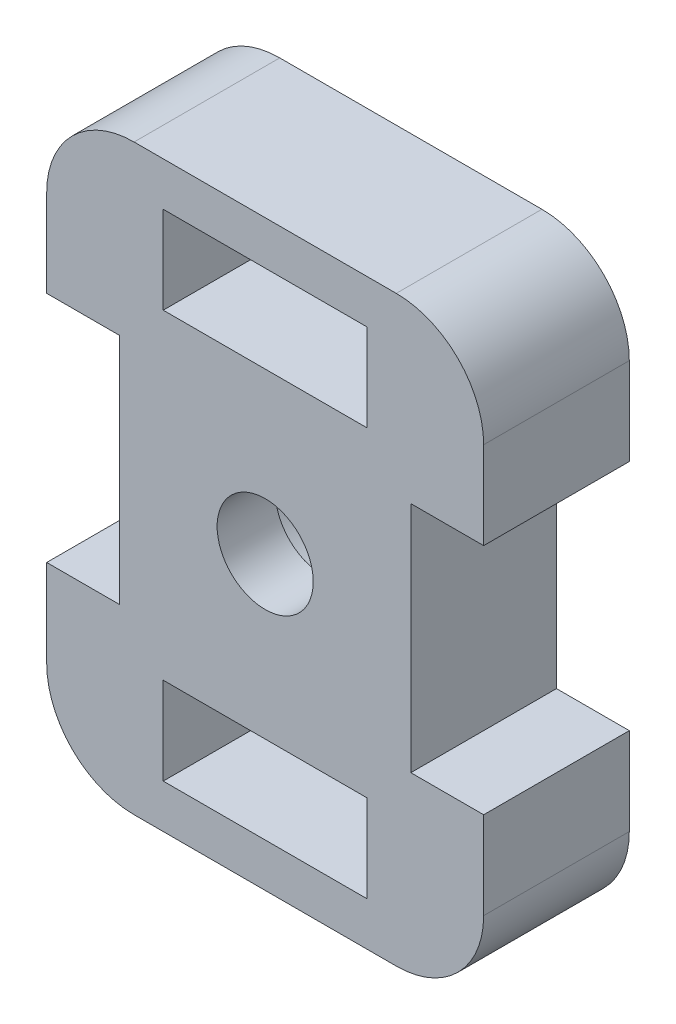
ISO-10303-21;
HEADER;
FILE_DESCRIPTION(('STEP AP214'),'2;1');
FILE_NAME('part.step','',(''),(''),'','','');
FILE_SCHEMA(('AUTOMOTIVE_DESIGN { 1 0 10303 214 1 1 1 1 }'));
ENDSEC;
DATA;
#1=APPLICATION_CONTEXT('core data for automotive mechanical design processes');
#2=APPLICATION_PROTOCOL_DEFINITION('international standard','automotive_design',2000,#1);
#3=PRODUCT_CONTEXT('',#1,'mechanical');
#4=PRODUCT('Part','Part','',(#3));
#5=PRODUCT_RELATED_PRODUCT_CATEGORY('part','',(#4));
#6=PRODUCT_DEFINITION_FORMATION('','',#4);
#7=PRODUCT_DEFINITION_CONTEXT('part definition',#1,'design');
#8=PRODUCT_DEFINITION('design','',#6,#7);
#9=PRODUCT_DEFINITION_SHAPE('','',#8);
#10=(LENGTH_UNIT() NAMED_UNIT(*) SI_UNIT(.MILLI.,.METRE.));
#11=(NAMED_UNIT(*) PLANE_ANGLE_UNIT() SI_UNIT($,.RADIAN.));
#12=(NAMED_UNIT(*) SI_UNIT($,.STERADIAN.) SOLID_ANGLE_UNIT());
#13=UNCERTAINTY_MEASURE_WITH_UNIT(LENGTH_MEASURE(1.E-05),#10,'distance_accuracy_value','');
#14=(GEOMETRIC_REPRESENTATION_CONTEXT(3) GLOBAL_UNCERTAINTY_ASSIGNED_CONTEXT((#13)) GLOBAL_UNIT_ASSIGNED_CONTEXT((#10,
#11,#12)) REPRESENTATION_CONTEXT('',''));
#15=CARTESIAN_POINT('',(0.,0.,0.));
#16=DIRECTION('',(0.,0.,1.));
#17=DIRECTION('',(1.,0.,0.));
#18=AXIS2_PLACEMENT_3D('',#15,#16,#17);
#19=CARTESIAN_POINT('',(0.,0.,40.));
#20=DIRECTION('',(0.,0.,1.));
#21=DIRECTION('',(1.,0.,0.));
#22=AXIS2_PLACEMENT_3D('',#19,#20,#21);
#23=CYLINDRICAL_SURFACE('',#22,1.65);
#24=CARTESIAN_POINT('',(0.,0.,45.));
#25=DIRECTION('',(0.,0.,-1.));
#26=DIRECTION('',(1.,0.,0.));
#27=AXIS2_PLACEMENT_3D('',#24,#25,#26);
#28=CIRCLE('',#27,1.65);
#29=CARTESIAN_POINT('',(1.65000000000001,0.,45.));
#30=VERTEX_POINT('',#29);
#31=EDGE_CURVE('E375',#30,#30,#28,.T.);
#32=ORIENTED_EDGE('',*,*,#31,.F.);
#33=EDGE_LOOP('',(#32));
#34=FACE_BOUND('',#33,.T.);
#35=CARTESIAN_POINT('',(0.,0.,43.));
#36=DIRECTION('',(0.,0.,-1.));
#37=DIRECTION('',(1.,0.,0.));
#38=AXIS2_PLACEMENT_3D('',#35,#36,#37);
#39=CIRCLE('',#38,1.65);
#40=CARTESIAN_POINT('',(1.65000000000001,0.,43.));
#41=VERTEX_POINT('',#40);
#42=EDGE_CURVE('E775',#41,#41,#39,.T.);
#43=ORIENTED_EDGE('',*,*,#42,.T.);
#44=EDGE_LOOP('',(#43));
#45=FACE_BOUND('',#44,.T.);
#46=ADVANCED_FACE('F16',(#34,#45),#23,.F.);
#47=CARTESIAN_POINT('',(3.5,7.27715203538537,40.));
#48=DIRECTION('',(1.,0.,0.));
#49=DIRECTION('',(0.,1.,0.));
#50=AXIS2_PLACEMENT_3D('',#47,#48,#49);
#51=PLANE('',#50);
#52=DIRECTION('',(0.,1.,0.));
#53=VECTOR('',#52,1.);
#54=CARTESIAN_POINT('',(3.5,7.27715203538537,45.));
#55=LINE('',#54,#53);
#56=CARTESIAN_POINT('',(3.5,5.5,45.));
#57=VERTEX_POINT('',#56);
#58=CARTESIAN_POINT('',(3.5,8.5,45.));
#59=VERTEX_POINT('',#58);
#60=EDGE_CURVE('E386',#57,#59,#55,.T.);
#61=ORIENTED_EDGE('',*,*,#60,.T.);
#62=DIRECTION('',(0.,0.,1.));
#63=VECTOR('',#62,1.);
#64=CARTESIAN_POINT('',(3.5,8.5,40.));
#65=LINE('',#64,#63);
#66=CARTESIAN_POINT('',(3.5,8.5,40.));
#67=VERTEX_POINT('',#66);
#68=EDGE_CURVE('E407',#67,#59,#65,.T.);
#69=ORIENTED_EDGE('',*,*,#68,.F.);
#70=DIRECTION('',(0.,1.,0.));
#71=VECTOR('',#70,1.);
#72=CARTESIAN_POINT('',(3.5,7.27715203538537,40.));
#73=LINE('',#72,#71);
#74=CARTESIAN_POINT('',(3.5,5.5,40.));
#75=VERTEX_POINT('',#74);
#76=EDGE_CURVE('E323',#75,#67,#73,.T.);
#77=ORIENTED_EDGE('',*,*,#76,.F.);
#78=DIRECTION('',(0.,0.,1.));
#79=VECTOR('',#78,1.);
#80=CARTESIAN_POINT('',(3.5,5.5,40.));
#81=LINE('',#80,#79);
#82=EDGE_CURVE('E397',#75,#57,#81,.T.);
#83=ORIENTED_EDGE('',*,*,#82,.T.);
#84=EDGE_LOOP('',(#61,#69,#77,#83));
#85=FACE_BOUND('',#84,.T.);
#86=ADVANCED_FACE('F561',(#85),#51,.F.);
#87=CARTESIAN_POINT('',(0.292325974442065,8.5,40.));
#88=DIRECTION('',(0.,1.,0.));
#89=DIRECTION('',(-1.,0.,0.));
#90=AXIS2_PLACEMENT_3D('',#87,#88,#89);
#91=PLANE('',#90);
#92=DIRECTION('',(-1.,0.,0.));
#93=VECTOR('',#92,1.);
#94=CARTESIAN_POINT('',(0.292325974442065,8.5,45.));
#95=LINE('',#94,#93);
#96=CARTESIAN_POINT('',(-3.5,8.5,45.));
#97=VERTEX_POINT('',#96);
#98=EDGE_CURVE('E390',#59,#97,#95,.T.);
#99=ORIENTED_EDGE('',*,*,#98,.T.);
#100=DIRECTION('',(0.,0.,1.));
#101=VECTOR('',#100,1.);
#102=CARTESIAN_POINT('',(-3.5,8.5,40.));
#103=LINE('',#102,#101);
#104=CARTESIAN_POINT('',(-3.5,8.5,40.));
#105=VERTEX_POINT('',#104);
#106=EDGE_CURVE('E404',#105,#97,#103,.T.);
#107=ORIENTED_EDGE('',*,*,#106,.F.);
#108=DIRECTION('',(-1.,0.,0.));
#109=VECTOR('',#108,1.);
#110=CARTESIAN_POINT('',(0.292325974442065,8.5,40.));
#111=LINE('',#110,#109);
#112=EDGE_CURVE('E327',#67,#105,#111,.T.);
#113=ORIENTED_EDGE('',*,*,#112,.F.);
#114=ORIENTED_EDGE('',*,*,#68,.T.);
#115=EDGE_LOOP('',(#99,#107,#113,#114));
#116=FACE_BOUND('',#115,.T.);
#117=ADVANCED_FACE('F566',(#116),#91,.F.);
#118=CARTESIAN_POINT('',(-3.5,6.55768603831532,40.));
#119=DIRECTION('',(1.,0.,0.));
#120=DIRECTION('',(0.,1.,0.));
#121=AXIS2_PLACEMENT_3D('',#118,#119,#120);
#122=PLANE('',#121);
#123=DIRECTION('',(0.,1.,0.));
#124=VECTOR('',#123,1.);
#125=CARTESIAN_POINT('',(-3.5,6.55768603831532,45.));
#126=LINE('',#125,#124);
#127=CARTESIAN_POINT('',(-3.5,5.5,45.));
#128=VERTEX_POINT('',#127);
#129=EDGE_CURVE('E270',#128,#97,#126,.T.);
#130=ORIENTED_EDGE('',*,*,#129,.F.);
#131=DIRECTION('',(0.,0.,1.));
#132=VECTOR('',#131,1.);
#133=CARTESIAN_POINT('',(-3.5,5.5,40.));
#134=LINE('',#133,#132);
#135=CARTESIAN_POINT('',(-3.5,5.5,40.));
#136=VERTEX_POINT('',#135);
#137=EDGE_CURVE('E400',#136,#128,#134,.T.);
#138=ORIENTED_EDGE('',*,*,#137,.F.);
#139=DIRECTION('',(0.,1.,0.));
#140=VECTOR('',#139,1.);
#141=CARTESIAN_POINT('',(-3.5,6.55768603831532,40.));
#142=LINE('',#141,#140);
#143=EDGE_CURVE('E330',#136,#105,#142,.T.);
#144=ORIENTED_EDGE('',*,*,#143,.T.);
#145=ORIENTED_EDGE('',*,*,#106,.T.);
#146=EDGE_LOOP('',(#130,#138,#144,#145));
#147=FACE_BOUND('',#146,.T.);
#148=ADVANCED_FACE('F590',(#147),#122,.T.);
#149=CARTESIAN_POINT('',(3.5,-7.23015354014933,40.));
#150=DIRECTION('',(1.,0.,0.));
#151=DIRECTION('',(0.,1.,0.));
#152=AXIS2_PLACEMENT_3D('',#149,#150,#151);
#153=PLANE('',#152);
#154=DIRECTION('',(0.,1.,0.));
#155=VECTOR('',#154,1.);
#156=CARTESIAN_POINT('',(3.5,-7.23015354014933,45.));
#157=LINE('',#156,#155);
#158=CARTESIAN_POINT('',(3.5,-8.5,45.));
#159=VERTEX_POINT('',#158);
#160=CARTESIAN_POINT('',(3.5,-5.5,45.));
#161=VERTEX_POINT('',#160);
#162=EDGE_CURVE('E353',#159,#161,#157,.T.);
#163=ORIENTED_EDGE('',*,*,#162,.T.);
#164=DIRECTION('',(0.,0.,1.));
#165=VECTOR('',#164,1.);
#166=CARTESIAN_POINT('',(3.5,-5.5,40.));
#167=LINE('',#166,#165);
#168=CARTESIAN_POINT('',(3.5,-5.5,40.));
#169=VERTEX_POINT('',#168);
#170=EDGE_CURVE('E401',#169,#161,#167,.T.);
#171=ORIENTED_EDGE('',*,*,#170,.F.);
#172=DIRECTION('',(0.,1.,0.));
#173=VECTOR('',#172,1.);
#174=CARTESIAN_POINT('',(3.5,-7.23015354014933,40.));
#175=LINE('',#174,#173);
#176=CARTESIAN_POINT('',(3.5,-8.5,40.));
#177=VERTEX_POINT('',#176);
#178=EDGE_CURVE('E275',#177,#169,#175,.T.);
#179=ORIENTED_EDGE('',*,*,#178,.F.);
#180=DIRECTION('',(0.,0.,1.));
#181=VECTOR('',#180,1.);
#182=CARTESIAN_POINT('',(3.5,-8.5,40.));
#183=LINE('',#182,#181);
#184=EDGE_CURVE('E243',#177,#159,#183,.T.);
#185=ORIENTED_EDGE('',*,*,#184,.T.);
#186=EDGE_LOOP('',(#163,#171,#179,#185));
#187=FACE_BOUND('',#186,.T.);
#188=ADVANCED_FACE('F586',(#187),#153,.F.);
#189=CARTESIAN_POINT('',(0.0222343951463693,-5.5,40.));
#190=DIRECTION('',(0.,1.,0.));
#191=DIRECTION('',(-1.,0.,0.));
#192=AXIS2_PLACEMENT_3D('',#189,#190,#191);
#193=PLANE('',#192);
#194=DIRECTION('',(-1.,0.,0.));
#195=VECTOR('',#194,1.);
#196=CARTESIAN_POINT('',(0.0222343951463693,-5.5,45.));
#197=LINE('',#196,#195);
#198=CARTESIAN_POINT('',(-3.5,-5.5,45.));
#199=VERTEX_POINT('',#198);
#200=EDGE_CURVE('E357',#161,#199,#197,.T.);
#201=ORIENTED_EDGE('',*,*,#200,.T.);
#202=DIRECTION('',(0.,0.,1.));
#203=VECTOR('',#202,1.);
#204=CARTESIAN_POINT('',(-3.5,-5.5,40.));
#205=LINE('',#204,#203);
#206=CARTESIAN_POINT('',(-3.5,-5.5,40.));
#207=VERTEX_POINT('',#206);
#208=EDGE_CURVE('E432',#207,#199,#205,.T.);
#209=ORIENTED_EDGE('',*,*,#208,.F.);
#210=DIRECTION('',(-1.,0.,0.));
#211=VECTOR('',#210,1.);
#212=CARTESIAN_POINT('',(0.0222343951463693,-5.5,40.));
#213=LINE('',#212,#211);
#214=EDGE_CURVE('E283',#169,#207,#213,.T.);
#215=ORIENTED_EDGE('',*,*,#214,.F.);
#216=ORIENTED_EDGE('',*,*,#170,.T.);
#217=EDGE_LOOP('',(#201,#209,#215,#216));
#218=FACE_BOUND('',#217,.T.);
#219=ADVANCED_FACE('F582',(#218),#193,.F.);
#220=CARTESIAN_POINT('',(-3.5,-4.68377959541974,40.));
#221=DIRECTION('',(1.,0.,0.));
#222=DIRECTION('',(0.,1.,0.));
#223=AXIS2_PLACEMENT_3D('',#220,#221,#222);
#224=PLANE('',#223);
#225=DIRECTION('',(0.,1.,0.));
#226=VECTOR('',#225,1.);
#227=CARTESIAN_POINT('',(-3.5,-4.68377959541974,45.));
#228=LINE('',#227,#226);
#229=CARTESIAN_POINT('',(-3.5,-8.5,45.));
#230=VERTEX_POINT('',#229);
#231=EDGE_CURVE('E361',#230,#199,#228,.T.);
#232=ORIENTED_EDGE('',*,*,#231,.F.);
#233=DIRECTION('',(0.,0.,1.));
#234=VECTOR('',#233,1.);
#235=CARTESIAN_POINT('',(-3.5,-8.5,40.));
#236=LINE('',#235,#234);
#237=CARTESIAN_POINT('',(-3.5,-8.5,40.));
#238=VERTEX_POINT('',#237);
#239=EDGE_CURVE('E429',#238,#230,#236,.T.);
#240=ORIENTED_EDGE('',*,*,#239,.F.);
#241=DIRECTION('',(0.,1.,0.));
#242=VECTOR('',#241,1.);
#243=CARTESIAN_POINT('',(-3.5,-4.68377959541974,40.));
#244=LINE('',#243,#242);
#245=EDGE_CURVE('E725',#238,#207,#244,.T.);
#246=ORIENTED_EDGE('',*,*,#245,.T.);
#247=ORIENTED_EDGE('',*,*,#208,.T.);
#248=EDGE_LOOP('',(#232,#240,#246,#247));
#249=FACE_BOUND('',#248,.T.);
#250=ADVANCED_FACE('F579',(#249),#224,.T.);
#251=CARTESIAN_POINT('',(0.,-4.,40.));
#252=DIRECTION('',(0.,1.,0.));
#253=DIRECTION('',(-1.,0.,0.));
#254=AXIS2_PLACEMENT_3D('',#251,#252,#253);
#255=PLANE('',#254);
#256=DIRECTION('',(-1.,0.,0.));
#257=VECTOR('',#256,1.);
#258=CARTESIAN_POINT('',(0.,-4.,45.));
#259=LINE('',#258,#257);
#260=CARTESIAN_POINT('',(7.5,-4.,45.));
#261=VERTEX_POINT('',#260);
#262=CARTESIAN_POINT('',(5.,-4.,45.));
#263=VERTEX_POINT('',#262);
#264=EDGE_CURVE('E238',#261,#263,#259,.T.);
#265=ORIENTED_EDGE('',*,*,#264,.F.);
#266=DIRECTION('',(0.,0.,1.));
#267=VECTOR('',#266,1.);
#268=CARTESIAN_POINT('',(7.5,-4.,40.));
#269=LINE('',#268,#267);
#270=CARTESIAN_POINT('',(7.5,-4.,40.));
#271=VERTEX_POINT('',#270);
#272=EDGE_CURVE('E232',#271,#261,#269,.T.);
#273=ORIENTED_EDGE('',*,*,#272,.F.);
#274=DIRECTION('',(-1.,0.,0.));
#275=VECTOR('',#274,1.);
#276=CARTESIAN_POINT('',(0.,-4.,40.));
#277=LINE('',#276,#275);
#278=CARTESIAN_POINT('',(5.,-4.,40.));
#279=VERTEX_POINT('',#278);
#280=EDGE_CURVE('E236',#271,#279,#277,.T.);
#281=ORIENTED_EDGE('',*,*,#280,.T.);
#282=DIRECTION('',(0.,0.,1.));
#283=VECTOR('',#282,1.);
#284=CARTESIAN_POINT('',(5.,-4.,40.));
#285=LINE('',#284,#283);
#286=EDGE_CURVE('E338',#279,#263,#285,.T.);
#287=ORIENTED_EDGE('',*,*,#286,.T.);
#288=EDGE_LOOP('',(#265,#273,#281,#287));
#289=FACE_BOUND('',#288,.T.);
#290=ADVANCED_FACE('F234',(#289),#255,.T.);
#291=CARTESIAN_POINT('',(7.5,-1.50786714585182,40.));
#292=DIRECTION('',(-1.,0.,0.));
#293=DIRECTION('',(0.,0.,1.));
#294=AXIS2_PLACEMENT_3D('',#291,#292,#293);
#295=PLANE('',#294);
#296=DIRECTION('',(0.,-1.,0.));
#297=VECTOR('',#296,1.);
#298=CARTESIAN_POINT('',(7.5,-1.50786714585182,45.));
#299=LINE('',#298,#297);
#300=CARTESIAN_POINT('',(7.5,-7.,45.));
#301=VERTEX_POINT('',#300);
#302=EDGE_CURVE('E340',#261,#301,#299,.T.);
#303=ORIENTED_EDGE('',*,*,#302,.T.);
#304=DIRECTION('',(0.,0.,1.));
#305=VECTOR('',#304,1.);
#306=CARTESIAN_POINT('',(7.5,-7.,40.));
#307=LINE('',#306,#305);
#308=CARTESIAN_POINT('',(7.5,-7.,40.));
#309=VERTEX_POINT('',#308);
#310=EDGE_CURVE('E250',#301,#309,#307,.F.);
#311=ORIENTED_EDGE('',*,*,#310,.T.);
#312=DIRECTION('',(0.,-1.,0.));
#313=VECTOR('',#312,1.);
#314=CARTESIAN_POINT('',(7.5,-1.50786714585182,40.));
#315=LINE('',#314,#313);
#316=EDGE_CURVE('E247',#271,#309,#315,.T.);
#317=ORIENTED_EDGE('',*,*,#316,.F.);
#318=ORIENTED_EDGE('',*,*,#272,.T.);
#319=EDGE_LOOP('',(#303,#311,#317,#318));
#320=FACE_BOUND('',#319,.T.);
#321=ADVANCED_FACE('F248',(#320),#295,.F.);
#322=CARTESIAN_POINT('',(0.,-10.,40.));
#323=DIRECTION('',(0.,-1.,0.));
#324=DIRECTION('',(0.,0.,-1.));
#325=AXIS2_PLACEMENT_3D('',#322,#323,#324);
#326=PLANE('',#325);
#327=DIRECTION('',(1.,0.,0.));
#328=VECTOR('',#327,1.);
#329=CARTESIAN_POINT('',(0.,-10.,40.));
#330=LINE('',#329,#328);
#331=CARTESIAN_POINT('',(-4.5,-10.,40.));
#332=VERTEX_POINT('',#331);
#333=CARTESIAN_POINT('',(4.5,-10.,40.));
#334=VERTEX_POINT('',#333);
#335=EDGE_CURVE('E253',#332,#334,#330,.T.);
#336=ORIENTED_EDGE('',*,*,#335,.T.);
#337=DIRECTION('',(0.,0.,1.));
#338=VECTOR('',#337,1.);
#339=CARTESIAN_POINT('',(4.5,-10.,45.));
#340=LINE('',#339,#338);
#341=CARTESIAN_POINT('',(4.5,-10.,45.));
#342=VERTEX_POINT('',#341);
#343=EDGE_CURVE('E446',#334,#342,#340,.T.);
#344=ORIENTED_EDGE('',*,*,#343,.T.);
#345=DIRECTION('',(1.,0.,0.));
#346=VECTOR('',#345,1.);
#347=CARTESIAN_POINT('',(0.,-10.,45.));
#348=LINE('',#347,#346);
#349=CARTESIAN_POINT('',(-4.5,-10.,45.));
#350=VERTEX_POINT('',#349);
#351=EDGE_CURVE('E344',#350,#342,#348,.T.);
#352=ORIENTED_EDGE('',*,*,#351,.F.);
#353=DIRECTION('',(0.,0.,1.));
#354=VECTOR('',#353,1.);
#355=CARTESIAN_POINT('',(-4.5,-10.,40.));
#356=LINE('',#355,#354);
#357=EDGE_CURVE('E411',#350,#332,#356,.F.);
#358=ORIENTED_EDGE('',*,*,#357,.T.);
#359=EDGE_LOOP('',(#336,#344,#352,#358));
#360=FACE_BOUND('',#359,.T.);
#361=ADVANCED_FACE('F531',(#360),#326,.T.);
#362=CARTESIAN_POINT('',(-7.5,-1.50786714585182,40.));
#363=DIRECTION('',(-1.,0.,0.));
#364=DIRECTION('',(0.,0.,1.));
#365=AXIS2_PLACEMENT_3D('',#362,#363,#364);
#366=PLANE('',#365);
#367=DIRECTION('',(0.,-1.,0.));
#368=VECTOR('',#367,1.);
#369=CARTESIAN_POINT('',(-7.5,-1.50786714585182,40.));
#370=LINE('',#369,#368);
#371=CARTESIAN_POINT('',(-7.5,-4.,40.));
#372=VERTEX_POINT('',#371);
#373=CARTESIAN_POINT('',(-7.5,-7.,40.));
#374=VERTEX_POINT('',#373);
#375=EDGE_CURVE('E276',#372,#374,#370,.T.);
#376=ORIENTED_EDGE('',*,*,#375,.T.);
#377=DIRECTION('',(0.,0.,1.));
#378=VECTOR('',#377,1.);
#379=CARTESIAN_POINT('',(-7.5,-7.,40.));
#380=LINE('',#379,#378);
#381=CARTESIAN_POINT('',(-7.5,-7.,45.));
#382=VERTEX_POINT('',#381);
#383=EDGE_CURVE('E475',#374,#382,#380,.T.);
#384=ORIENTED_EDGE('',*,*,#383,.T.);
#385=DIRECTION('',(0.,-1.,0.));
#386=VECTOR('',#385,1.);
#387=CARTESIAN_POINT('',(-7.5,-1.50786714585182,45.));
#388=LINE('',#387,#386);
#389=CARTESIAN_POINT('',(-7.5,-4.,45.));
#390=VERTEX_POINT('',#389);
#391=EDGE_CURVE('E349',#390,#382,#388,.T.);
#392=ORIENTED_EDGE('',*,*,#391,.F.);
#393=DIRECTION('',(0.,0.,1.));
#394=VECTOR('',#393,1.);
#395=CARTESIAN_POINT('',(-7.5,-4.,40.));
#396=LINE('',#395,#394);
#397=EDGE_CURVE('E244',#372,#390,#396,.T.);
#398=ORIENTED_EDGE('',*,*,#397,.F.);
#399=EDGE_LOOP('',(#376,#384,#392,#398));
#400=FACE_BOUND('',#399,.T.);
#401=ADVANCED_FACE('F526',(#400),#366,.T.);
#402=CARTESIAN_POINT('',(-5.,-4.,45.));
#403=VERTEX_POINT('',#402);
#404=EDGE_CURVE('E342',#403,#390,#259,.T.);
#405=ORIENTED_EDGE('',*,*,#404,.F.);
#406=DIRECTION('',(0.,0.,1.));
#407=VECTOR('',#406,1.);
#408=CARTESIAN_POINT('',(-5.,-4.,40.));
#409=LINE('',#408,#407);
#410=CARTESIAN_POINT('',(-5.,-4.,40.));
#411=VERTEX_POINT('',#410);
#412=EDGE_CURVE('E426',#411,#403,#409,.T.);
#413=ORIENTED_EDGE('',*,*,#412,.F.);
#414=EDGE_CURVE('E264',#411,#372,#277,.T.);
#415=ORIENTED_EDGE('',*,*,#414,.T.);
#416=ORIENTED_EDGE('',*,*,#397,.T.);
#417=EDGE_LOOP('',(#405,#413,#415,#416));
#418=FACE_BOUND('',#417,.T.);
#419=ADVANCED_FACE('F522',(#418),#255,.T.);
#420=CARTESIAN_POINT('',(-5.,0.,40.));
#421=DIRECTION('',(1.,0.,0.));
#422=DIRECTION('',(0.,1.,0.));
#423=AXIS2_PLACEMENT_3D('',#420,#421,#422);
#424=PLANE('',#423);
#425=DIRECTION('',(0.,1.,0.));
#426=VECTOR('',#425,1.);
#427=CARTESIAN_POINT('',(-5.,0.,45.));
#428=LINE('',#427,#426);
#429=CARTESIAN_POINT('',(-5.,4.,45.));
#430=VERTEX_POINT('',#429);
#431=EDGE_CURVE('E369',#403,#430,#428,.T.);
#432=ORIENTED_EDGE('',*,*,#431,.T.);
#433=DIRECTION('',(0.,0.,1.));
#434=VECTOR('',#433,1.);
#435=CARTESIAN_POINT('',(-5.,4.,40.));
#436=LINE('',#435,#434);
#437=CARTESIAN_POINT('',(-5.,4.,40.));
#438=VERTEX_POINT('',#437);
#439=EDGE_CURVE('E420',#438,#430,#436,.T.);
#440=ORIENTED_EDGE('',*,*,#439,.F.);
#441=DIRECTION('',(0.,1.,0.));
#442=VECTOR('',#441,1.);
#443=CARTESIAN_POINT('',(-5.,0.,40.));
#444=LINE('',#443,#442);
#445=EDGE_CURVE('E740',#411,#438,#444,.T.);
#446=ORIENTED_EDGE('',*,*,#445,.F.);
#447=ORIENTED_EDGE('',*,*,#412,.T.);
#448=EDGE_LOOP('',(#432,#440,#446,#447));
#449=FACE_BOUND('',#448,.T.);
#450=ADVANCED_FACE('F559',(#449),#424,.F.);
#451=CARTESIAN_POINT('',(0.,4.,40.));
#452=DIRECTION('',(0.,1.,0.));
#453=DIRECTION('',(-1.,0.,0.));
#454=AXIS2_PLACEMENT_3D('',#451,#452,#453);
#455=PLANE('',#454);
#456=DIRECTION('',(-1.,0.,0.));
#457=VECTOR('',#456,1.);
#458=CARTESIAN_POINT('',(0.,4.,45.));
#459=LINE('',#458,#457);
#460=CARTESIAN_POINT('',(-7.5,4.,45.));
#461=VERTEX_POINT('',#460);
#462=EDGE_CURVE('E382',#430,#461,#459,.T.);
#463=ORIENTED_EDGE('',*,*,#462,.T.);
#464=DIRECTION('',(0.,0.,1.));
#465=VECTOR('',#464,1.);
#466=CARTESIAN_POINT('',(-7.5,4.,40.));
#467=LINE('',#466,#465);
#468=CARTESIAN_POINT('',(-7.5,4.,40.));
#469=VERTEX_POINT('',#468);
#470=EDGE_CURVE('E416',#469,#461,#467,.T.);
#471=ORIENTED_EDGE('',*,*,#470,.F.);
#472=DIRECTION('',(-1.,0.,0.));
#473=VECTOR('',#472,1.);
#474=CARTESIAN_POINT('',(0.,4.,40.));
#475=LINE('',#474,#473);
#476=EDGE_CURVE('E301',#438,#469,#475,.T.);
#477=ORIENTED_EDGE('',*,*,#476,.F.);
#478=ORIENTED_EDGE('',*,*,#439,.T.);
#479=EDGE_LOOP('',(#463,#471,#477,#478));
#480=FACE_BOUND('',#479,.T.);
#481=ADVANCED_FACE('F516',(#480),#455,.F.);
#482=CARTESIAN_POINT('',(-7.5,7.,45.));
#483=VERTEX_POINT('',#482);
#484=EDGE_CURVE('E352',#483,#461,#388,.T.);
#485=ORIENTED_EDGE('',*,*,#484,.F.);
#486=DIRECTION('',(0.,0.,1.));
#487=VECTOR('',#486,1.);
#488=CARTESIAN_POINT('',(-7.5,7.,40.));
#489=LINE('',#488,#487);
#490=CARTESIAN_POINT('',(-7.5,7.,40.));
#491=VERTEX_POINT('',#490);
#492=EDGE_CURVE('E25',#483,#491,#489,.F.);
#493=ORIENTED_EDGE('',*,*,#492,.T.);
#494=EDGE_CURVE('E288',#491,#469,#370,.T.);
#495=ORIENTED_EDGE('',*,*,#494,.T.);
#496=ORIENTED_EDGE('',*,*,#470,.T.);
#497=EDGE_LOOP('',(#485,#493,#495,#496));
#498=FACE_BOUND('',#497,.T.);
#499=ADVANCED_FACE('F487',(#498),#366,.T.);
#500=CARTESIAN_POINT('',(0.,10.,40.));
#501=DIRECTION('',(0.,-1.,0.));
#502=DIRECTION('',(0.,0.,-1.));
#503=AXIS2_PLACEMENT_3D('',#500,#501,#502);
#504=PLANE('',#503);
#505=DIRECTION('',(1.,0.,0.));
#506=VECTOR('',#505,1.);
#507=CARTESIAN_POINT('',(0.,10.,40.));
#508=LINE('',#507,#506);
#509=CARTESIAN_POINT('',(-4.5,10.,40.));
#510=VERTEX_POINT('',#509);
#511=CARTESIAN_POINT('',(4.5,10.,40.));
#512=VERTEX_POINT('',#511);
#513=EDGE_CURVE('E300',#510,#512,#508,.T.);
#514=ORIENTED_EDGE('',*,*,#513,.F.);
#515=DIRECTION('',(0.,0.,1.));
#516=VECTOR('',#515,1.);
#517=CARTESIAN_POINT('',(-4.5,10.,45.));
#518=LINE('',#517,#516);
#519=CARTESIAN_POINT('',(-4.5,10.,45.));
#520=VERTEX_POINT('',#519);
#521=EDGE_CURVE('E480',#510,#520,#518,.T.);
#522=ORIENTED_EDGE('',*,*,#521,.T.);
#523=DIRECTION('',(1.,0.,0.));
#524=VECTOR('',#523,1.);
#525=CARTESIAN_POINT('',(0.,10.,45.));
#526=LINE('',#525,#524);
#527=CARTESIAN_POINT('',(4.5,10.,45.));
#528=VERTEX_POINT('',#527);
#529=EDGE_CURVE('E383',#520,#528,#526,.T.);
#530=ORIENTED_EDGE('',*,*,#529,.T.);
#531=DIRECTION('',(0.,0.,1.));
#532=VECTOR('',#531,1.);
#533=CARTESIAN_POINT('',(4.5,10.,40.));
#534=LINE('',#533,#532);
#535=EDGE_CURVE('E47',#528,#512,#534,.F.);
#536=ORIENTED_EDGE('',*,*,#535,.T.);
#537=EDGE_LOOP('',(#514,#522,#530,#536));
#538=FACE_BOUND('',#537,.T.);
#539=ADVANCED_FACE('F493',(#538),#504,.F.);
#540=CARTESIAN_POINT('',(7.5,7.,40.));
#541=VERTEX_POINT('',#540);
#542=CARTESIAN_POINT('',(7.5,4.,40.));
#543=VERTEX_POINT('',#542);
#544=EDGE_CURVE('E255',#541,#543,#315,.T.);
#545=ORIENTED_EDGE('',*,*,#544,.F.);
#546=DIRECTION('',(0.,0.,1.));
#547=VECTOR('',#546,1.);
#548=CARTESIAN_POINT('',(7.5,7.,40.));
#549=LINE('',#548,#547);
#550=CARTESIAN_POINT('',(7.5,7.,45.));
#551=VERTEX_POINT('',#550);
#552=EDGE_CURVE('E10',#541,#551,#549,.T.);
#553=ORIENTED_EDGE('',*,*,#552,.T.);
#554=CARTESIAN_POINT('',(7.5,4.,45.));
#555=VERTEX_POINT('',#554);
#556=EDGE_CURVE('E345',#551,#555,#299,.T.);
#557=ORIENTED_EDGE('',*,*,#556,.T.);
#558=DIRECTION('',(0.,0.,1.));
#559=VECTOR('',#558,1.);
#560=CARTESIAN_POINT('',(7.5,4.,40.));
#561=LINE('',#560,#559);
#562=EDGE_CURVE('E412',#543,#555,#561,.T.);
#563=ORIENTED_EDGE('',*,*,#562,.F.);
#564=EDGE_LOOP('',(#545,#553,#557,#563));
#565=FACE_BOUND('',#564,.T.);
#566=ADVANCED_FACE('F502',(#565),#295,.F.);
#567=CARTESIAN_POINT('',(5.,4.,45.));
#568=VERTEX_POINT('',#567);
#569=EDGE_CURVE('E379',#555,#568,#459,.T.);
#570=ORIENTED_EDGE('',*,*,#569,.T.);
#571=DIRECTION('',(0.,0.,1.));
#572=VECTOR('',#571,1.);
#573=CARTESIAN_POINT('',(5.,4.,40.));
#574=LINE('',#573,#572);
#575=CARTESIAN_POINT('',(5.,4.,40.));
#576=VERTEX_POINT('',#575);
#577=EDGE_CURVE('E417',#576,#568,#574,.T.);
#578=ORIENTED_EDGE('',*,*,#577,.F.);
#579=EDGE_CURVE('E312',#543,#576,#475,.T.);
#580=ORIENTED_EDGE('',*,*,#579,.F.);
#581=ORIENTED_EDGE('',*,*,#562,.T.);
#582=EDGE_LOOP('',(#570,#578,#580,#581));
#583=FACE_BOUND('',#582,.T.);
#584=ADVANCED_FACE('F543',(#583),#455,.F.);
#585=CARTESIAN_POINT('',(0.292325974442064,5.5,40.));
#586=DIRECTION('',(0.,1.,0.));
#587=DIRECTION('',(-1.,0.,0.));
#588=AXIS2_PLACEMENT_3D('',#585,#586,#587);
#589=PLANE('',#588);
#590=DIRECTION('',(-1.,0.,0.));
#591=VECTOR('',#590,1.);
#592=CARTESIAN_POINT('',(0.292325974442064,5.5,45.));
#593=LINE('',#592,#591);
#594=EDGE_CURVE('E262',#57,#128,#593,.T.);
#595=ORIENTED_EDGE('',*,*,#594,.F.);
#596=ORIENTED_EDGE('',*,*,#82,.F.);
#597=DIRECTION('',(-1.,0.,0.));
#598=VECTOR('',#597,1.);
#599=CARTESIAN_POINT('',(0.292325974442064,5.5,40.));
#600=LINE('',#599,#598);
#601=EDGE_CURVE('E334',#75,#136,#600,.T.);
#602=ORIENTED_EDGE('',*,*,#601,.T.);
#603=ORIENTED_EDGE('',*,*,#137,.T.);
#604=EDGE_LOOP('',(#595,#596,#602,#603));
#605=FACE_BOUND('',#604,.T.);
#606=ADVANCED_FACE('F545',(#605),#589,.T.);
#607=CARTESIAN_POINT('',(0.02223439514637,-8.5,40.));
#608=DIRECTION('',(0.,1.,0.));
#609=DIRECTION('',(-1.,0.,0.));
#610=AXIS2_PLACEMENT_3D('',#607,#608,#609);
#611=PLANE('',#610);
#612=DIRECTION('',(-1.,0.,0.));
#613=VECTOR('',#612,1.);
#614=CARTESIAN_POINT('',(0.02223439514637,-8.5,45.));
#615=LINE('',#614,#613);
#616=EDGE_CURVE('E365',#159,#230,#615,.T.);
#617=ORIENTED_EDGE('',*,*,#616,.F.);
#618=ORIENTED_EDGE('',*,*,#184,.F.);
#619=DIRECTION('',(-1.,0.,0.));
#620=VECTOR('',#619,1.);
#621=CARTESIAN_POINT('',(0.02223439514637,-8.5,40.));
#622=LINE('',#621,#620);
#623=EDGE_CURVE('E728',#177,#238,#622,.T.);
#624=ORIENTED_EDGE('',*,*,#623,.T.);
#625=ORIENTED_EDGE('',*,*,#239,.T.);
#626=EDGE_LOOP('',(#617,#618,#624,#625));
#627=FACE_BOUND('',#626,.T.);
#628=ADVANCED_FACE('F552',(#627),#611,.T.);
#629=CARTESIAN_POINT('',(5.,0.,40.));
#630=DIRECTION('',(1.,0.,0.));
#631=DIRECTION('',(0.,1.,0.));
#632=AXIS2_PLACEMENT_3D('',#629,#630,#631);
#633=PLANE('',#632);
#634=DIRECTION('',(0.,1.,0.));
#635=VECTOR('',#634,1.);
#636=CARTESIAN_POINT('',(5.,0.,45.));
#637=LINE('',#636,#635);
#638=EDGE_CURVE('E372',#263,#568,#637,.T.);
#639=ORIENTED_EDGE('',*,*,#638,.F.);
#640=ORIENTED_EDGE('',*,*,#286,.F.);
#641=DIRECTION('',(0.,1.,0.));
#642=VECTOR('',#641,1.);
#643=CARTESIAN_POINT('',(5.,0.,40.));
#644=LINE('',#643,#642);
#645=EDGE_CURVE('E260',#279,#576,#644,.T.);
#646=ORIENTED_EDGE('',*,*,#645,.T.);
#647=ORIENTED_EDGE('',*,*,#577,.T.);
#648=EDGE_LOOP('',(#639,#640,#646,#647));
#649=FACE_BOUND('',#648,.T.);
#650=ADVANCED_FACE('F540',(#649),#633,.T.);
#651=CARTESIAN_POINT('',(0.,0.,40.));
#652=DIRECTION('',(0.,0.,-1.));
#653=DIRECTION('',(1.,0.,0.));
#654=AXIS2_PLACEMENT_3D('',#651,#652,#653);
#655=PLANE('',#654);
#656=CARTESIAN_POINT('',(0.,0.,40.));
#657=DIRECTION('',(0.,0.,-1.));
#658=DIRECTION('',(-1.,0.,0.));
#659=AXIS2_PLACEMENT_3D('',#656,#657,#658);
#660=CIRCLE('',#659,3.);
#661=CARTESIAN_POINT('',(-2.99999999999999,0.,40.));
#662=VERTEX_POINT('',#661);
#663=EDGE_CURVE('E779',#662,#662,#660,.T.);
#664=ORIENTED_EDGE('',*,*,#663,.F.);
#665=EDGE_LOOP('',(#664));
#666=FACE_BOUND('',#665,.T.);
#667=ORIENTED_EDGE('',*,*,#316,.T.);
#668=CARTESIAN_POINT('',(4.5,-7.,40.));
#669=DIRECTION('',(0.,0.,-1.));
#670=DIRECTION('',(-1.,0.,0.));
#671=AXIS2_PLACEMENT_3D('',#668,#669,#670);
#672=CIRCLE('',#671,3.);
#673=EDGE_CURVE('E472',#309,#334,#672,.T.);
#674=ORIENTED_EDGE('',*,*,#673,.T.);
#675=ORIENTED_EDGE('',*,*,#335,.F.);
#676=CARTESIAN_POINT('',(-4.5,-7.,40.));
#677=DIRECTION('',(0.,0.,-1.));
#678=DIRECTION('',(-1.,0.,0.));
#679=AXIS2_PLACEMENT_3D('',#676,#677,#678);
#680=CIRCLE('',#679,3.);
#681=EDGE_CURVE('E469',#332,#374,#680,.T.);
#682=ORIENTED_EDGE('',*,*,#681,.T.);
#683=ORIENTED_EDGE('',*,*,#375,.F.);
#684=ORIENTED_EDGE('',*,*,#414,.F.);
#685=ORIENTED_EDGE('',*,*,#445,.T.);
#686=ORIENTED_EDGE('',*,*,#476,.T.);
#687=ORIENTED_EDGE('',*,*,#494,.F.);
#688=CARTESIAN_POINT('',(-4.5,7.,40.));
#689=DIRECTION('',(0.,0.,-1.));
#690=DIRECTION('',(-1.,0.,0.));
#691=AXIS2_PLACEMENT_3D('',#688,#689,#690);
#692=CIRCLE('',#691,3.);
#693=EDGE_CURVE('E466',#491,#510,#692,.T.);
#694=ORIENTED_EDGE('',*,*,#693,.T.);
#695=ORIENTED_EDGE('',*,*,#513,.T.);
#696=CARTESIAN_POINT('',(4.5,7.,40.));
#697=DIRECTION('',(0.,0.,-1.));
#698=DIRECTION('',(-1.,0.,0.));
#699=AXIS2_PLACEMENT_3D('',#696,#697,#698);
#700=CIRCLE('',#699,3.);
#701=EDGE_CURVE('E37',#512,#541,#700,.T.);
#702=ORIENTED_EDGE('',*,*,#701,.T.);
#703=ORIENTED_EDGE('',*,*,#544,.T.);
#704=ORIENTED_EDGE('',*,*,#579,.T.);
#705=ORIENTED_EDGE('',*,*,#645,.F.);
#706=ORIENTED_EDGE('',*,*,#280,.F.);
#707=EDGE_LOOP('',(#667,#674,#675,#682,#683,#684,#685,#686,#687,#694,#695,#702,#703,#704,#705,#706));
#708=FACE_BOUND('',#707,.T.);
#709=ORIENTED_EDGE('',*,*,#178,.T.);
#710=ORIENTED_EDGE('',*,*,#214,.T.);
#711=ORIENTED_EDGE('',*,*,#245,.F.);
#712=ORIENTED_EDGE('',*,*,#623,.F.);
#713=EDGE_LOOP('',(#709,#710,#711,#712));
#714=FACE_BOUND('',#713,.T.);
#715=ORIENTED_EDGE('',*,*,#76,.T.);
#716=ORIENTED_EDGE('',*,*,#112,.T.);
#717=ORIENTED_EDGE('',*,*,#143,.F.);
#718=ORIENTED_EDGE('',*,*,#601,.F.);
#719=EDGE_LOOP('',(#715,#716,#717,#718));
#720=FACE_BOUND('',#719,.T.);
#721=ADVANCED_FACE('F257',(#666,#708,#714,#720),#655,.T.);
#722=CARTESIAN_POINT('',(0.,0.,45.));
#723=DIRECTION('',(0.,0.,-1.));
#724=DIRECTION('',(1.,0.,0.));
#725=AXIS2_PLACEMENT_3D('',#722,#723,#724);
#726=PLANE('',#725);
#727=ORIENTED_EDGE('',*,*,#351,.T.);
#728=CARTESIAN_POINT('',(4.5,-7.,45.));
#729=DIRECTION('',(0.,0.,-1.));
#730=DIRECTION('',(-1.,0.,0.));
#731=AXIS2_PLACEMENT_3D('',#728,#729,#730);
#732=CIRCLE('',#731,3.);
#733=EDGE_CURVE('E459',#342,#301,#732,.F.);
#734=ORIENTED_EDGE('',*,*,#733,.T.);
#735=ORIENTED_EDGE('',*,*,#302,.F.);
#736=ORIENTED_EDGE('',*,*,#264,.T.);
#737=ORIENTED_EDGE('',*,*,#638,.T.);
#738=ORIENTED_EDGE('',*,*,#569,.F.);
#739=ORIENTED_EDGE('',*,*,#556,.F.);
#740=CARTESIAN_POINT('',(4.5,7.,45.));
#741=DIRECTION('',(0.,0.,-1.));
#742=DIRECTION('',(-1.,0.,0.));
#743=AXIS2_PLACEMENT_3D('',#740,#741,#742);
#744=CIRCLE('',#743,3.);
#745=EDGE_CURVE('E450',#551,#528,#744,.F.);
#746=ORIENTED_EDGE('',*,*,#745,.T.);
#747=ORIENTED_EDGE('',*,*,#529,.F.);
#748=CARTESIAN_POINT('',(-4.5,7.,45.));
#749=DIRECTION('',(0.,0.,-1.));
#750=DIRECTION('',(-1.,0.,0.));
#751=AXIS2_PLACEMENT_3D('',#748,#749,#750);
#752=CIRCLE('',#751,3.);
#753=EDGE_CURVE('E453',#520,#483,#752,.F.);
#754=ORIENTED_EDGE('',*,*,#753,.T.);
#755=ORIENTED_EDGE('',*,*,#484,.T.);
#756=ORIENTED_EDGE('',*,*,#462,.F.);
#757=ORIENTED_EDGE('',*,*,#431,.F.);
#758=ORIENTED_EDGE('',*,*,#404,.T.);
#759=ORIENTED_EDGE('',*,*,#391,.T.);
#760=CARTESIAN_POINT('',(-4.5,-7.,45.));
#761=DIRECTION('',(0.,0.,-1.));
#762=DIRECTION('',(-1.,0.,0.));
#763=AXIS2_PLACEMENT_3D('',#760,#761,#762);
#764=CIRCLE('',#763,3.);
#765=EDGE_CURVE('E456',#382,#350,#764,.F.);
#766=ORIENTED_EDGE('',*,*,#765,.T.);
#767=EDGE_LOOP('',(#727,#734,#735,#736,#737,#738,#739,#746,#747,#754,#755,#756,#757,#758,#759,#766));
#768=FACE_BOUND('',#767,.T.);
#769=ORIENTED_EDGE('',*,*,#162,.F.);
#770=ORIENTED_EDGE('',*,*,#616,.T.);
#771=ORIENTED_EDGE('',*,*,#231,.T.);
#772=ORIENTED_EDGE('',*,*,#200,.F.);
#773=EDGE_LOOP('',(#769,#770,#771,#772));
#774=FACE_BOUND('',#773,.T.);
#775=ORIENTED_EDGE('',*,*,#60,.F.);
#776=ORIENTED_EDGE('',*,*,#594,.T.);
#777=ORIENTED_EDGE('',*,*,#129,.T.);
#778=ORIENTED_EDGE('',*,*,#98,.F.);
#779=EDGE_LOOP('',(#775,#776,#777,#778));
#780=FACE_BOUND('',#779,.T.);
#781=ORIENTED_EDGE('',*,*,#31,.T.);
#782=EDGE_LOOP('',(#781));
#783=FACE_BOUND('',#782,.T.);
#784=ADVANCED_FACE('F495',(#768,#774,#780,#783),#726,.F.);
#785=CARTESIAN_POINT('',(4.5,-7.,40.));
#786=DIRECTION('',(0.,0.,-1.));
#787=DIRECTION('',(-1.,0.,0.));
#788=AXIS2_PLACEMENT_3D('',#785,#786,#787);
#789=CYLINDRICAL_SURFACE('',#788,3.);
#790=ORIENTED_EDGE('',*,*,#673,.F.);
#791=ORIENTED_EDGE('',*,*,#310,.F.);
#792=ORIENTED_EDGE('',*,*,#733,.F.);
#793=ORIENTED_EDGE('',*,*,#343,.F.);
#794=EDGE_LOOP('',(#790,#791,#792,#793));
#795=FACE_BOUND('',#794,.T.);
#796=ADVANCED_FACE('F537',(#795),#789,.T.);
#797=CARTESIAN_POINT('',(-4.5,-7.,40.));
#798=DIRECTION('',(0.,0.,1.));
#799=DIRECTION('',(1.,0.,0.));
#800=AXIS2_PLACEMENT_3D('',#797,#798,#799);
#801=CYLINDRICAL_SURFACE('',#800,3.);
#802=ORIENTED_EDGE('',*,*,#681,.F.);
#803=ORIENTED_EDGE('',*,*,#357,.F.);
#804=ORIENTED_EDGE('',*,*,#765,.F.);
#805=ORIENTED_EDGE('',*,*,#383,.F.);
#806=EDGE_LOOP('',(#802,#803,#804,#805));
#807=FACE_BOUND('',#806,.T.);
#808=ADVANCED_FACE('F535',(#807),#801,.T.);
#809=CARTESIAN_POINT('',(-4.5,7.,40.));
#810=DIRECTION('',(0.,0.,-1.));
#811=DIRECTION('',(-1.,0.,0.));
#812=AXIS2_PLACEMENT_3D('',#809,#810,#811);
#813=CYLINDRICAL_SURFACE('',#812,3.);
#814=ORIENTED_EDGE('',*,*,#693,.F.);
#815=ORIENTED_EDGE('',*,*,#492,.F.);
#816=ORIENTED_EDGE('',*,*,#753,.F.);
#817=ORIENTED_EDGE('',*,*,#521,.F.);
#818=EDGE_LOOP('',(#814,#815,#816,#817));
#819=FACE_BOUND('',#818,.T.);
#820=ADVANCED_FACE('F491',(#819),#813,.T.);
#821=CARTESIAN_POINT('',(4.5,7.,40.));
#822=DIRECTION('',(0.,0.,1.));
#823=DIRECTION('',(1.,0.,0.));
#824=AXIS2_PLACEMENT_3D('',#821,#822,#823);
#825=CYLINDRICAL_SURFACE('',#824,3.);
#826=ORIENTED_EDGE('',*,*,#701,.F.);
#827=ORIENTED_EDGE('',*,*,#535,.F.);
#828=ORIENTED_EDGE('',*,*,#745,.F.);
#829=ORIENTED_EDGE('',*,*,#552,.F.);
#830=EDGE_LOOP('',(#826,#827,#828,#829));
#831=FACE_BOUND('',#830,.T.);
#832=ADVANCED_FACE('F18',(#831),#825,.T.);
#833=CARTESIAN_POINT('',(0.,0.,43.));
#834=DIRECTION('',(0.,0.,-1.));
#835=DIRECTION('',(-1.,0.,0.));
#836=AXIS2_PLACEMENT_3D('',#833,#834,#835);
#837=CYLINDRICAL_SURFACE('',#836,3.);
#838=CARTESIAN_POINT('',(0.,0.,43.));
#839=DIRECTION('',(0.,0.,-1.));
#840=DIRECTION('',(-1.,0.,0.));
#841=AXIS2_PLACEMENT_3D('',#838,#839,#840);
#842=CIRCLE('',#841,3.);
#843=CARTESIAN_POINT('',(-2.99999999999999,0.,43.));
#844=VERTEX_POINT('',#843);
#845=EDGE_CURVE('E341',#844,#844,#842,.T.);
#846=ORIENTED_EDGE('',*,*,#845,.F.);
#847=EDGE_LOOP('',(#846));
#848=FACE_BOUND('',#847,.T.);
#849=ORIENTED_EDGE('',*,*,#663,.T.);
#850=EDGE_LOOP('',(#849));
#851=FACE_BOUND('',#850,.T.);
#852=ADVANCED_FACE('F602',(#848,#851),#837,.F.);
#853=CARTESIAN_POINT('',(0.,0.,43.));
#854=DIRECTION('',(0.,0.,-1.));
#855=DIRECTION('',(1.,0.,0.));
#856=AXIS2_PLACEMENT_3D('',#853,#854,#855);
#857=PLANE('',#856);
#858=ORIENTED_EDGE('',*,*,#42,.F.);
#859=EDGE_LOOP('',(#858));
#860=FACE_BOUND('',#859,.T.);
#861=ORIENTED_EDGE('',*,*,#845,.T.);
#862=EDGE_LOOP('',(#861));
#863=FACE_BOUND('',#862,.T.);
#864=ADVANCED_FACE('F606',(#860,#863),#857,.T.);
#865=CLOSED_SHELL('',(#46,#86,#117,#148,#188,#219,#250,#290,#321,#361,#401,#419,#450,#481,#499,
#539,#566,#584,#606,#628,#650,#721,#784,#796,#808,#820,#832,#852,#864));
#866=MANIFOLD_SOLID_BREP('B1',#865);
#867=ADVANCED_BREP_SHAPE_REPRESENTATION('',(#18,#866),#14);
#868=SHAPE_DEFINITION_REPRESENTATION(#9,#867);
ENDSEC;
END-ISO-10303-21;
